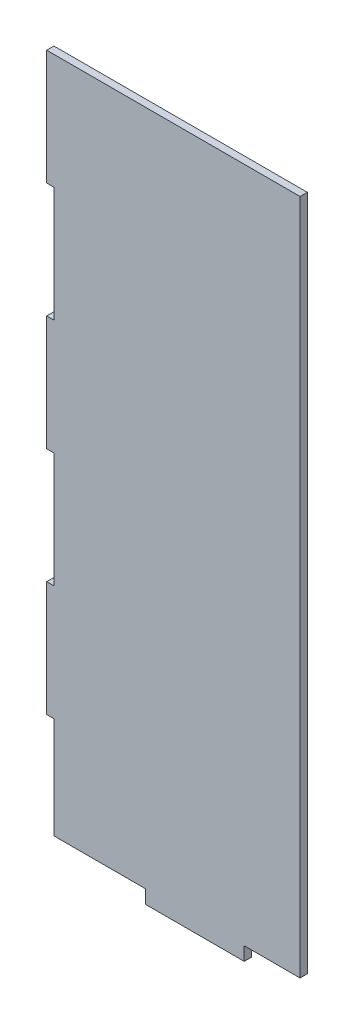
ISO-10303-21;
HEADER;
FILE_DESCRIPTION(('STEP AP214'),'2;1');
FILE_NAME('part.step','',(''),(''),'','','');
FILE_SCHEMA(('AUTOMOTIVE_DESIGN { 1 0 10303 214 1 1 1 1 }'));
ENDSEC;
DATA;
#1=APPLICATION_CONTEXT('core data for automotive mechanical design processes');
#2=APPLICATION_PROTOCOL_DEFINITION('international standard','automotive_design',2000,#1);
#3=PRODUCT_CONTEXT('',#1,'mechanical');
#4=PRODUCT('Part','Part','',(#3));
#5=PRODUCT_RELATED_PRODUCT_CATEGORY('part','',(#4));
#6=PRODUCT_DEFINITION_FORMATION('','',#4);
#7=PRODUCT_DEFINITION_CONTEXT('part definition',#1,'design');
#8=PRODUCT_DEFINITION('design','',#6,#7);
#9=PRODUCT_DEFINITION_SHAPE('','',#8);
#10=(LENGTH_UNIT() NAMED_UNIT(*) SI_UNIT(.MILLI.,.METRE.));
#11=(NAMED_UNIT(*) PLANE_ANGLE_UNIT() SI_UNIT($,.RADIAN.));
#12=(NAMED_UNIT(*) SI_UNIT($,.STERADIAN.) SOLID_ANGLE_UNIT());
#13=UNCERTAINTY_MEASURE_WITH_UNIT(LENGTH_MEASURE(1.E-05),#10,'distance_accuracy_value','');
#14=(GEOMETRIC_REPRESENTATION_CONTEXT(3) GLOBAL_UNCERTAINTY_ASSIGNED_CONTEXT((#13)) GLOBAL_UNIT_ASSIGNED_CONTEXT((#10,
#11,#12)) REPRESENTATION_CONTEXT('',''));
#15=CARTESIAN_POINT('',(0.,0.,0.));
#16=DIRECTION('',(0.,0.,1.));
#17=DIRECTION('',(1.,0.,0.));
#18=AXIS2_PLACEMENT_3D('',#15,#16,#17);
#19=CARTESIAN_POINT('',(0.,139.7,1.4986));
#20=DIRECTION('',(0.,1.,0.));
#21=DIRECTION('',(0.,0.,1.));
#22=AXIS2_PLACEMENT_3D('',#19,#20,#21);
#23=PLANE('',#22);
#24=DIRECTION('',(0.,0.,1.));
#25=VECTOR('',#24,1.);
#26=CARTESIAN_POINT('',(-38.1,139.7,-1.4986));
#27=LINE('',#26,#25);
#28=CARTESIAN_POINT('',(-38.1,139.7,-1.4986));
#29=VERTEX_POINT('',#28);
#30=CARTESIAN_POINT('',(-38.1,139.7,1.4986));
#31=VERTEX_POINT('',#30);
#32=EDGE_CURVE('E308',#29,#31,#27,.T.);
#33=ORIENTED_EDGE('',*,*,#32,.F.);
#34=DIRECTION('',(1.,0.,0.));
#35=VECTOR('',#34,1.);
#36=CARTESIAN_POINT('',(0.,139.7,-1.4986));
#37=LINE('',#36,#35);
#38=CARTESIAN_POINT('',(-142.6972,139.7,-1.4986));
#39=VERTEX_POINT('',#38);
#40=EDGE_CURVE('E195',#39,#29,#37,.T.);
#41=ORIENTED_EDGE('',*,*,#40,.F.);
#42=DIRECTION('',(0.,0.,-1.));
#43=VECTOR('',#42,1.);
#44=CARTESIAN_POINT('',(-142.6972,139.7,1.4986));
#45=LINE('',#44,#43);
#46=CARTESIAN_POINT('',(-142.6972,139.7,1.4986));
#47=VERTEX_POINT('',#46);
#48=EDGE_CURVE('E11',#47,#39,#45,.T.);
#49=ORIENTED_EDGE('',*,*,#48,.F.);
#50=DIRECTION('',(1.,0.,0.));
#51=VECTOR('',#50,1.);
#52=CARTESIAN_POINT('',(0.,139.7,1.4986));
#53=LINE('',#52,#51);
#54=EDGE_CURVE('E316',#47,#31,#53,.T.);
#55=ORIENTED_EDGE('',*,*,#54,.T.);
#56=EDGE_LOOP('',(#33,#41,#49,#55));
#57=FACE_BOUND('',#56,.T.);
#58=ADVANCED_FACE('F36',(#57),#23,.T.);
#59=CARTESIAN_POINT('',(-142.6972,0.,1.4986));
#60=DIRECTION('',(1.,0.,0.));
#61=DIRECTION('',(0.,0.,-1.));
#62=AXIS2_PLACEMENT_3D('',#59,#60,#61);
#63=PLANE('',#62);
#64=DIRECTION('',(0.,-1.,0.));
#65=VECTOR('',#64,1.);
#66=CARTESIAN_POINT('',(-142.6972,0.,-1.4986));
#67=LINE('',#66,#65);
#68=CARTESIAN_POINT('',(-142.6972,92.202,-1.4986));
#69=VERTEX_POINT('',#68);
#70=EDGE_CURVE('E198',#39,#69,#67,.T.);
#71=ORIENTED_EDGE('',*,*,#70,.T.);
#72=DIRECTION('',(0.,0.,-1.));
#73=VECTOR('',#72,1.);
#74=CARTESIAN_POINT('',(-142.6972,92.202,1.4986));
#75=LINE('',#74,#73);
#76=CARTESIAN_POINT('',(-142.6972,92.202,1.4986));
#77=VERTEX_POINT('',#76);
#78=EDGE_CURVE('E43',#77,#69,#75,.T.);
#79=ORIENTED_EDGE('',*,*,#78,.F.);
#80=DIRECTION('',(0.,-1.,0.));
#81=VECTOR('',#80,1.);
#82=CARTESIAN_POINT('',(-142.6972,0.,1.4986));
#83=LINE('',#82,#81);
#84=EDGE_CURVE('E318',#47,#77,#83,.T.);
#85=ORIENTED_EDGE('',*,*,#84,.F.);
#86=ORIENTED_EDGE('',*,*,#48,.T.);
#87=EDGE_LOOP('',(#71,#79,#85,#86));
#88=FACE_BOUND('',#87,.T.);
#89=ADVANCED_FACE('F269',(#88),#63,.F.);
#90=CARTESIAN_POINT('',(0.,92.202,1.4986));
#91=DIRECTION('',(0.,-1.,0.));
#92=DIRECTION('',(0.,0.,-1.));
#93=AXIS2_PLACEMENT_3D('',#90,#91,#92);
#94=PLANE('',#93);
#95=DIRECTION('',(-1.,0.,0.));
#96=VECTOR('',#95,1.);
#97=CARTESIAN_POINT('',(0.,92.202,-1.4986));
#98=LINE('',#97,#96);
#99=CARTESIAN_POINT('',(-139.7,92.202,-1.4986));
#100=VERTEX_POINT('',#99);
#101=EDGE_CURVE('E201',#100,#69,#98,.T.);
#102=ORIENTED_EDGE('',*,*,#101,.F.);
#103=DIRECTION('',(0.,0.,-1.));
#104=VECTOR('',#103,1.);
#105=CARTESIAN_POINT('',(-139.7,92.202,1.4986));
#106=LINE('',#105,#104);
#107=CARTESIAN_POINT('',(-139.7,92.202,1.4986));
#108=VERTEX_POINT('',#107);
#109=EDGE_CURVE('E259',#108,#100,#106,.T.);
#110=ORIENTED_EDGE('',*,*,#109,.F.);
#111=DIRECTION('',(-1.,0.,0.));
#112=VECTOR('',#111,1.);
#113=CARTESIAN_POINT('',(0.,92.202,1.4986));
#114=LINE('',#113,#112);
#115=EDGE_CURVE('E266',#108,#77,#114,.T.);
#116=ORIENTED_EDGE('',*,*,#115,.T.);
#117=ORIENTED_EDGE('',*,*,#78,.T.);
#118=EDGE_LOOP('',(#102,#110,#116,#117));
#119=FACE_BOUND('',#118,.T.);
#120=ADVANCED_FACE('F264',(#119),#94,.T.);
#121=CARTESIAN_POINT('',(-139.7,0.,1.4986));
#122=DIRECTION('',(1.,0.,0.));
#123=DIRECTION('',(0.,0.,-1.));
#124=AXIS2_PLACEMENT_3D('',#121,#122,#123);
#125=PLANE('',#124);
#126=DIRECTION('',(0.,-1.,0.));
#127=VECTOR('',#126,1.);
#128=CARTESIAN_POINT('',(-139.7,0.,-1.4986));
#129=LINE('',#128,#127);
#130=CARTESIAN_POINT('',(-139.7,44.704,-1.4986));
#131=VERTEX_POINT('',#130);
#132=EDGE_CURVE('E204',#100,#131,#129,.T.);
#133=ORIENTED_EDGE('',*,*,#132,.T.);
#134=DIRECTION('',(0.,0.,-1.));
#135=VECTOR('',#134,1.);
#136=CARTESIAN_POINT('',(-139.7,44.704,1.4986));
#137=LINE('',#136,#135);
#138=CARTESIAN_POINT('',(-139.7,44.704,1.4986));
#139=VERTEX_POINT('',#138);
#140=EDGE_CURVE('E256',#139,#131,#137,.T.);
#141=ORIENTED_EDGE('',*,*,#140,.F.);
#142=DIRECTION('',(0.,-1.,0.));
#143=VECTOR('',#142,1.);
#144=CARTESIAN_POINT('',(-139.7,0.,1.4986));
#145=LINE('',#144,#143);
#146=EDGE_CURVE('E286',#108,#139,#145,.T.);
#147=ORIENTED_EDGE('',*,*,#146,.F.);
#148=ORIENTED_EDGE('',*,*,#109,.T.);
#149=EDGE_LOOP('',(#133,#141,#147,#148));
#150=FACE_BOUND('',#149,.T.);
#151=ADVANCED_FACE('F277',(#150),#125,.F.);
#152=CARTESIAN_POINT('',(0.,44.704,1.4986));
#153=DIRECTION('',(0.,-1.,0.));
#154=DIRECTION('',(0.,0.,-1.));
#155=AXIS2_PLACEMENT_3D('',#152,#153,#154);
#156=PLANE('',#155);
#157=DIRECTION('',(-1.,0.,0.));
#158=VECTOR('',#157,1.);
#159=CARTESIAN_POINT('',(0.,44.704,-1.4986));
#160=LINE('',#159,#158);
#161=CARTESIAN_POINT('',(-142.6972,44.704,-1.4986));
#162=VERTEX_POINT('',#161);
#163=EDGE_CURVE('E206',#131,#162,#160,.T.);
#164=ORIENTED_EDGE('',*,*,#163,.T.);
#165=DIRECTION('',(0.,0.,-1.));
#166=VECTOR('',#165,1.);
#167=CARTESIAN_POINT('',(-142.6972,44.704,1.4986));
#168=LINE('',#167,#166);
#169=CARTESIAN_POINT('',(-142.6972,44.704,1.4986));
#170=VERTEX_POINT('',#169);
#171=EDGE_CURVE('E253',#170,#162,#168,.T.);
#172=ORIENTED_EDGE('',*,*,#171,.F.);
#173=DIRECTION('',(-1.,0.,0.));
#174=VECTOR('',#173,1.);
#175=CARTESIAN_POINT('',(0.,44.704,1.4986));
#176=LINE('',#175,#174);
#177=EDGE_CURVE('E283',#139,#170,#176,.T.);
#178=ORIENTED_EDGE('',*,*,#177,.F.);
#179=ORIENTED_EDGE('',*,*,#140,.T.);
#180=EDGE_LOOP('',(#164,#172,#178,#179));
#181=FACE_BOUND('',#180,.T.);
#182=ADVANCED_FACE('F281',(#181),#156,.F.);
#183=CARTESIAN_POINT('',(-142.697199999999,0.,1.4986));
#184=DIRECTION('',(1.,0.,0.));
#185=DIRECTION('',(0.,0.,-1.));
#186=AXIS2_PLACEMENT_3D('',#183,#184,#185);
#187=PLANE('',#186);
#188=DIRECTION('',(0.,-1.,0.));
#189=VECTOR('',#188,1.);
#190=CARTESIAN_POINT('',(-142.697199999999,0.,-1.4986));
#191=LINE('',#190,#189);
#192=CARTESIAN_POINT('',(-142.697199999999,-2.79400000000005,-1.4986));
#193=VERTEX_POINT('',#192);
#194=EDGE_CURVE('E210',#162,#193,#191,.T.);
#195=ORIENTED_EDGE('',*,*,#194,.T.);
#196=DIRECTION('',(0.,0.,-1.));
#197=VECTOR('',#196,1.);
#198=CARTESIAN_POINT('',(-142.697199999999,-2.79400000000005,1.4986));
#199=LINE('',#198,#197);
#200=CARTESIAN_POINT('',(-142.697199999999,-2.79400000000005,1.4986));
#201=VERTEX_POINT('',#200);
#202=EDGE_CURVE('E251',#201,#193,#199,.T.);
#203=ORIENTED_EDGE('',*,*,#202,.F.);
#204=DIRECTION('',(0.,-1.,0.));
#205=VECTOR('',#204,1.);
#206=CARTESIAN_POINT('',(-142.697199999999,0.,1.4986));
#207=LINE('',#206,#205);
#208=EDGE_CURVE('E285',#170,#201,#207,.T.);
#209=ORIENTED_EDGE('',*,*,#208,.F.);
#210=ORIENTED_EDGE('',*,*,#171,.T.);
#211=EDGE_LOOP('',(#195,#203,#209,#210));
#212=FACE_BOUND('',#211,.T.);
#213=ADVANCED_FACE('F354',(#212),#187,.F.);
#214=CARTESIAN_POINT('',(0.,-2.79400000000005,1.4986));
#215=DIRECTION('',(0.,-1.,0.));
#216=DIRECTION('',(0.,0.,-1.));
#217=AXIS2_PLACEMENT_3D('',#214,#215,#216);
#218=PLANE('',#217);
#219=DIRECTION('',(-1.,0.,0.));
#220=VECTOR('',#219,1.);
#221=CARTESIAN_POINT('',(0.,-2.79400000000005,-1.4986));
#222=LINE('',#221,#220);
#223=CARTESIAN_POINT('',(-139.7,-2.79400000000005,-1.4986));
#224=VERTEX_POINT('',#223);
#225=EDGE_CURVE('E213',#224,#193,#222,.T.);
#226=ORIENTED_EDGE('',*,*,#225,.F.);
#227=DIRECTION('',(0.,0.,-1.));
#228=VECTOR('',#227,1.);
#229=CARTESIAN_POINT('',(-139.7,-2.79400000000005,1.4986));
#230=LINE('',#229,#228);
#231=CARTESIAN_POINT('',(-139.7,-2.79400000000005,1.4986));
#232=VERTEX_POINT('',#231);
#233=EDGE_CURVE('E249',#232,#224,#230,.T.);
#234=ORIENTED_EDGE('',*,*,#233,.F.);
#235=DIRECTION('',(-1.,0.,0.));
#236=VECTOR('',#235,1.);
#237=CARTESIAN_POINT('',(0.,-2.79400000000005,1.4986));
#238=LINE('',#237,#236);
#239=EDGE_CURVE('E288',#232,#201,#238,.T.);
#240=ORIENTED_EDGE('',*,*,#239,.T.);
#241=ORIENTED_EDGE('',*,*,#202,.T.);
#242=EDGE_LOOP('',(#226,#234,#240,#241));
#243=FACE_BOUND('',#242,.T.);
#244=ADVANCED_FACE('F352',(#243),#218,.T.);
#245=CARTESIAN_POINT('',(-139.7,-50.2920000000001,-1.4986));
#246=VERTEX_POINT('',#245);
#247=EDGE_CURVE('E208',#224,#246,#129,.T.);
#248=ORIENTED_EDGE('',*,*,#247,.T.);
#249=DIRECTION('',(0.,0.,-1.));
#250=VECTOR('',#249,1.);
#251=CARTESIAN_POINT('',(-139.7,-50.2920000000001,1.4986));
#252=LINE('',#251,#250);
#253=CARTESIAN_POINT('',(-139.7,-50.2920000000001,1.4986));
#254=VERTEX_POINT('',#253);
#255=EDGE_CURVE('E246',#254,#246,#252,.T.);
#256=ORIENTED_EDGE('',*,*,#255,.F.);
#257=EDGE_CURVE('E292',#232,#254,#145,.T.);
#258=ORIENTED_EDGE('',*,*,#257,.F.);
#259=ORIENTED_EDGE('',*,*,#233,.T.);
#260=EDGE_LOOP('',(#248,#256,#258,#259));
#261=FACE_BOUND('',#260,.T.);
#262=ADVANCED_FACE('F336',(#261),#125,.F.);
#263=CARTESIAN_POINT('',(0.,-50.2920000000001,1.4986));
#264=DIRECTION('',(0.,-1.,0.));
#265=DIRECTION('',(0.,0.,-1.));
#266=AXIS2_PLACEMENT_3D('',#263,#264,#265);
#267=PLANE('',#266);
#268=DIRECTION('',(-1.,0.,0.));
#269=VECTOR('',#268,1.);
#270=CARTESIAN_POINT('',(0.,-50.2920000000001,-1.4986));
#271=LINE('',#270,#269);
#272=CARTESIAN_POINT('',(-142.697199999999,-50.2920000000001,-1.4986));
#273=VERTEX_POINT('',#272);
#274=EDGE_CURVE('E216',#246,#273,#271,.T.);
#275=ORIENTED_EDGE('',*,*,#274,.T.);
#276=DIRECTION('',(0.,0.,-1.));
#277=VECTOR('',#276,1.);
#278=CARTESIAN_POINT('',(-142.697199999999,-50.2920000000001,1.4986));
#279=LINE('',#278,#277);
#280=CARTESIAN_POINT('',(-142.697199999999,-50.2920000000001,1.4986));
#281=VERTEX_POINT('',#280);
#282=EDGE_CURVE('E243',#281,#273,#279,.T.);
#283=ORIENTED_EDGE('',*,*,#282,.F.);
#284=DIRECTION('',(-1.,0.,0.));
#285=VECTOR('',#284,1.);
#286=CARTESIAN_POINT('',(0.,-50.2920000000001,1.4986));
#287=LINE('',#286,#285);
#288=EDGE_CURVE('E297',#254,#281,#287,.T.);
#289=ORIENTED_EDGE('',*,*,#288,.F.);
#290=ORIENTED_EDGE('',*,*,#255,.T.);
#291=EDGE_LOOP('',(#275,#283,#289,#290));
#292=FACE_BOUND('',#291,.T.);
#293=ADVANCED_FACE('F342',(#292),#267,.F.);
#294=CARTESIAN_POINT('',(-142.697199999998,0.,1.4986));
#295=DIRECTION('',(1.,0.,0.));
#296=DIRECTION('',(0.,0.,-1.));
#297=AXIS2_PLACEMENT_3D('',#294,#295,#296);
#298=PLANE('',#297);
#299=DIRECTION('',(0.,-1.,0.));
#300=VECTOR('',#299,1.);
#301=CARTESIAN_POINT('',(-142.697199999998,0.,-1.4986));
#302=LINE('',#301,#300);
#303=CARTESIAN_POINT('',(-142.697199999998,-97.7900000000001,-1.4986));
#304=VERTEX_POINT('',#303);
#305=EDGE_CURVE('E218',#273,#304,#302,.T.);
#306=ORIENTED_EDGE('',*,*,#305,.T.);
#307=DIRECTION('',(0.,0.,-1.));
#308=VECTOR('',#307,1.);
#309=CARTESIAN_POINT('',(-142.697199999998,-97.7900000000001,1.4986));
#310=LINE('',#309,#308);
#311=CARTESIAN_POINT('',(-142.697199999998,-97.7900000000001,1.4986));
#312=VERTEX_POINT('',#311);
#313=EDGE_CURVE('E241',#312,#304,#310,.T.);
#314=ORIENTED_EDGE('',*,*,#313,.F.);
#315=DIRECTION('',(0.,-1.,0.));
#316=VECTOR('',#315,1.);
#317=CARTESIAN_POINT('',(-142.697199999998,0.,1.4986));
#318=LINE('',#317,#316);
#319=EDGE_CURVE('E299',#281,#312,#318,.T.);
#320=ORIENTED_EDGE('',*,*,#319,.F.);
#321=ORIENTED_EDGE('',*,*,#282,.T.);
#322=EDGE_LOOP('',(#306,#314,#320,#321));
#323=FACE_BOUND('',#322,.T.);
#324=ADVANCED_FACE('F347',(#323),#298,.F.);
#325=CARTESIAN_POINT('',(0.,-97.7900000000001,1.4986));
#326=DIRECTION('',(0.,-1.,0.));
#327=DIRECTION('',(0.,0.,-1.));
#328=AXIS2_PLACEMENT_3D('',#325,#326,#327);
#329=PLANE('',#328);
#330=DIRECTION('',(-1.,0.,0.));
#331=VECTOR('',#330,1.);
#332=CARTESIAN_POINT('',(0.,-97.7900000000001,-1.4986));
#333=LINE('',#332,#331);
#334=CARTESIAN_POINT('',(-139.7,-97.7900000000001,-1.4986));
#335=VERTEX_POINT('',#334);
#336=EDGE_CURVE('E221',#335,#304,#333,.T.);
#337=ORIENTED_EDGE('',*,*,#336,.F.);
#338=DIRECTION('',(0.,0.,-1.));
#339=VECTOR('',#338,1.);
#340=CARTESIAN_POINT('',(-139.7,-97.7900000000001,1.4986));
#341=LINE('',#340,#339);
#342=CARTESIAN_POINT('',(-139.7,-97.7900000000001,1.4986));
#343=VERTEX_POINT('',#342);
#344=EDGE_CURVE('E239',#343,#335,#341,.T.);
#345=ORIENTED_EDGE('',*,*,#344,.F.);
#346=DIRECTION('',(-1.,0.,0.));
#347=VECTOR('',#346,1.);
#348=CARTESIAN_POINT('',(0.,-97.7900000000001,1.4986));
#349=LINE('',#348,#347);
#350=EDGE_CURVE('E301',#343,#312,#349,.T.);
#351=ORIENTED_EDGE('',*,*,#350,.T.);
#352=ORIENTED_EDGE('',*,*,#313,.T.);
#353=EDGE_LOOP('',(#337,#345,#351,#352));
#354=FACE_BOUND('',#353,.T.);
#355=ADVANCED_FACE('F381',(#354),#329,.T.);
#356=CARTESIAN_POINT('',(-139.7,-139.7,-1.4986));
#357=VERTEX_POINT('',#356);
#358=EDGE_CURVE('E207',#335,#357,#129,.T.);
#359=ORIENTED_EDGE('',*,*,#358,.T.);
#360=DIRECTION('',(0.,0.,-1.));
#361=VECTOR('',#360,1.);
#362=CARTESIAN_POINT('',(-139.7,-139.7,1.4986));
#363=LINE('',#362,#361);
#364=CARTESIAN_POINT('',(-139.7,-139.7,1.4986));
#365=VERTEX_POINT('',#364);
#366=EDGE_CURVE('E236',#365,#357,#363,.T.);
#367=ORIENTED_EDGE('',*,*,#366,.F.);
#368=EDGE_CURVE('E291',#343,#365,#145,.T.);
#369=ORIENTED_EDGE('',*,*,#368,.F.);
#370=ORIENTED_EDGE('',*,*,#344,.T.);
#371=EDGE_LOOP('',(#359,#367,#369,#370));
#372=FACE_BOUND('',#371,.T.);
#373=ADVANCED_FACE('F331',(#372),#125,.F.);
#374=CARTESIAN_POINT('',(0.,-139.7,1.4986));
#375=DIRECTION('',(0.,1.,0.));
#376=DIRECTION('',(0.,0.,1.));
#377=AXIS2_PLACEMENT_3D('',#374,#375,#376);
#378=PLANE('',#377);
#379=DIRECTION('',(1.,0.,0.));
#380=VECTOR('',#379,1.);
#381=CARTESIAN_POINT('',(0.,-139.7,-1.4986));
#382=LINE('',#381,#380);
#383=CARTESIAN_POINT('',(-101.926571428571,-139.7,-1.4986));
#384=VERTEX_POINT('',#383);
#385=EDGE_CURVE('E224',#357,#384,#382,.T.);
#386=ORIENTED_EDGE('',*,*,#385,.T.);
#387=DIRECTION('',(0.,0.,-1.));
#388=VECTOR('',#387,1.);
#389=CARTESIAN_POINT('',(-101.926571428571,-139.7,1.4986));
#390=LINE('',#389,#388);
#391=CARTESIAN_POINT('',(-101.926571428571,-139.7,1.4986));
#392=VERTEX_POINT('',#391);
#393=EDGE_CURVE('E185',#392,#384,#390,.T.);
#394=ORIENTED_EDGE('',*,*,#393,.F.);
#395=DIRECTION('',(1.,0.,0.));
#396=VECTOR('',#395,1.);
#397=CARTESIAN_POINT('',(0.,-139.7,1.4986));
#398=LINE('',#397,#396);
#399=EDGE_CURVE('E172',#365,#392,#398,.T.);
#400=ORIENTED_EDGE('',*,*,#399,.F.);
#401=ORIENTED_EDGE('',*,*,#366,.T.);
#402=EDGE_LOOP('',(#386,#394,#400,#401));
#403=FACE_BOUND('',#402,.T.);
#404=ADVANCED_FACE('F327',(#403),#378,.F.);
#405=CARTESIAN_POINT('',(-101.926571428571,0.,1.4986));
#406=DIRECTION('',(1.,0.,0.));
#407=DIRECTION('',(0.,0.,-1.));
#408=AXIS2_PLACEMENT_3D('',#405,#406,#407);
#409=PLANE('',#408);
#410=DIRECTION('',(0.,-1.,0.));
#411=VECTOR('',#410,1.);
#412=CARTESIAN_POINT('',(-101.926571428571,0.,-1.4986));
#413=LINE('',#412,#411);
#414=CARTESIAN_POINT('',(-101.926571428571,-145.288,-1.4986));
#415=VERTEX_POINT('',#414);
#416=EDGE_CURVE('E181',#384,#415,#413,.T.);
#417=ORIENTED_EDGE('',*,*,#416,.T.);
#418=DIRECTION('',(0.,0.,-1.));
#419=VECTOR('',#418,1.);
#420=CARTESIAN_POINT('',(-101.926571428571,-145.288,1.4986));
#421=LINE('',#420,#419);
#422=CARTESIAN_POINT('',(-101.926571428571,-145.288,1.4986));
#423=VERTEX_POINT('',#422);
#424=EDGE_CURVE('E178',#423,#415,#421,.T.);
#425=ORIENTED_EDGE('',*,*,#424,.F.);
#426=DIRECTION('',(0.,-1.,0.));
#427=VECTOR('',#426,1.);
#428=CARTESIAN_POINT('',(-101.926571428571,0.,1.4986));
#429=LINE('',#428,#427);
#430=EDGE_CURVE('E164',#392,#423,#429,.T.);
#431=ORIENTED_EDGE('',*,*,#430,.F.);
#432=ORIENTED_EDGE('',*,*,#393,.T.);
#433=EDGE_LOOP('',(#417,#425,#431,#432));
#434=FACE_BOUND('',#433,.T.);
#435=ADVANCED_FACE('F179',(#434),#409,.F.);
#436=CARTESIAN_POINT('',(0.,-145.288,1.4986));
#437=DIRECTION('',(0.,-1.,0.));
#438=DIRECTION('',(0.,0.,-1.));
#439=AXIS2_PLACEMENT_3D('',#436,#437,#438);
#440=PLANE('',#439);
#441=DIRECTION('',(-1.,0.,0.));
#442=VECTOR('',#441,1.);
#443=CARTESIAN_POINT('',(0.,-145.288,-1.4986));
#444=LINE('',#443,#442);
#445=CARTESIAN_POINT('',(-61.1559428571429,-145.288,-1.4986));
#446=VERTEX_POINT('',#445);
#447=EDGE_CURVE('E228',#446,#415,#444,.T.);
#448=ORIENTED_EDGE('',*,*,#447,.F.);
#449=DIRECTION('',(0.,0.,-1.));
#450=VECTOR('',#449,1.);
#451=CARTESIAN_POINT('',(-61.1559428571429,-145.288,1.4986));
#452=LINE('',#451,#450);
#453=CARTESIAN_POINT('',(-61.1559428571429,-145.288,1.4986));
#454=VERTEX_POINT('',#453);
#455=EDGE_CURVE('E186',#454,#446,#452,.T.);
#456=ORIENTED_EDGE('',*,*,#455,.F.);
#457=DIRECTION('',(-1.,0.,0.));
#458=VECTOR('',#457,1.);
#459=CARTESIAN_POINT('',(0.,-145.288,1.4986));
#460=LINE('',#459,#458);
#461=EDGE_CURVE('E170',#454,#423,#460,.T.);
#462=ORIENTED_EDGE('',*,*,#461,.T.);
#463=ORIENTED_EDGE('',*,*,#424,.T.);
#464=EDGE_LOOP('',(#448,#456,#462,#463));
#465=FACE_BOUND('',#464,.T.);
#466=ADVANCED_FACE('F188',(#465),#440,.T.);
#467=CARTESIAN_POINT('',(-61.1559428571429,0.,1.4986));
#468=DIRECTION('',(1.,0.,0.));
#469=DIRECTION('',(0.,0.,-1.));
#470=AXIS2_PLACEMENT_3D('',#467,#468,#469);
#471=PLANE('',#470);
#472=DIRECTION('',(0.,-1.,0.));
#473=VECTOR('',#472,1.);
#474=CARTESIAN_POINT('',(-61.1559428571429,0.,-1.4986));
#475=LINE('',#474,#473);
#476=CARTESIAN_POINT('',(-61.1559428571429,-139.7,-1.4986));
#477=VERTEX_POINT('',#476);
#478=EDGE_CURVE('E230',#477,#446,#475,.T.);
#479=ORIENTED_EDGE('',*,*,#478,.F.);
#480=DIRECTION('',(0.,0.,-1.));
#481=VECTOR('',#480,1.);
#482=CARTESIAN_POINT('',(-61.1559428571429,-139.7,1.4986));
#483=LINE('',#482,#481);
#484=CARTESIAN_POINT('',(-61.1559428571429,-139.7,1.4986));
#485=VERTEX_POINT('',#484);
#486=EDGE_CURVE('E59',#485,#477,#483,.T.);
#487=ORIENTED_EDGE('',*,*,#486,.F.);
#488=DIRECTION('',(0.,-1.,0.));
#489=VECTOR('',#488,1.);
#490=CARTESIAN_POINT('',(-61.1559428571429,0.,1.4986));
#491=LINE('',#490,#489);
#492=EDGE_CURVE('E189',#485,#454,#491,.T.);
#493=ORIENTED_EDGE('',*,*,#492,.T.);
#494=ORIENTED_EDGE('',*,*,#455,.T.);
#495=EDGE_LOOP('',(#479,#487,#493,#494));
#496=FACE_BOUND('',#495,.T.);
#497=ADVANCED_FACE('F322',(#496),#471,.T.);
#498=CARTESIAN_POINT('',(-38.1,-139.7,-1.4986));
#499=VERTEX_POINT('',#498);
#500=EDGE_CURVE('E226',#477,#499,#382,.T.);
#501=ORIENTED_EDGE('',*,*,#500,.T.);
#502=DIRECTION('',(0.,0.,1.));
#503=VECTOR('',#502,1.);
#504=CARTESIAN_POINT('',(-38.1,-139.7,-1.4986));
#505=LINE('',#504,#503);
#506=CARTESIAN_POINT('',(-38.1,-139.7,1.4986));
#507=VERTEX_POINT('',#506);
#508=EDGE_CURVE('E50',#499,#507,#505,.T.);
#509=ORIENTED_EDGE('',*,*,#508,.T.);
#510=EDGE_CURVE('E191',#485,#507,#398,.T.);
#511=ORIENTED_EDGE('',*,*,#510,.F.);
#512=ORIENTED_EDGE('',*,*,#486,.T.);
#513=EDGE_LOOP('',(#501,#509,#511,#512));
#514=FACE_BOUND('',#513,.T.);
#515=ADVANCED_FACE('F307',(#514),#378,.F.);
#516=CARTESIAN_POINT('',(0.,0.,1.4986));
#517=DIRECTION('',(0.,0.,1.));
#518=DIRECTION('',(1.,0.,0.));
#519=AXIS2_PLACEMENT_3D('',#516,#517,#518);
#520=PLANE('',#519);
#521=DIRECTION('',(0.,-1.,0.));
#522=VECTOR('',#521,1.);
#523=CARTESIAN_POINT('',(-38.1,0.,1.4986));
#524=LINE('',#523,#522);
#525=EDGE_CURVE('E306',#31,#507,#524,.T.);
#526=ORIENTED_EDGE('',*,*,#525,.F.);
#527=ORIENTED_EDGE('',*,*,#54,.F.);
#528=ORIENTED_EDGE('',*,*,#84,.T.);
#529=ORIENTED_EDGE('',*,*,#115,.F.);
#530=ORIENTED_EDGE('',*,*,#146,.T.);
#531=ORIENTED_EDGE('',*,*,#177,.T.);
#532=ORIENTED_EDGE('',*,*,#208,.T.);
#533=ORIENTED_EDGE('',*,*,#239,.F.);
#534=ORIENTED_EDGE('',*,*,#257,.T.);
#535=ORIENTED_EDGE('',*,*,#288,.T.);
#536=ORIENTED_EDGE('',*,*,#319,.T.);
#537=ORIENTED_EDGE('',*,*,#350,.F.);
#538=ORIENTED_EDGE('',*,*,#368,.T.);
#539=ORIENTED_EDGE('',*,*,#399,.T.);
#540=ORIENTED_EDGE('',*,*,#430,.T.);
#541=ORIENTED_EDGE('',*,*,#461,.F.);
#542=ORIENTED_EDGE('',*,*,#492,.F.);
#543=ORIENTED_EDGE('',*,*,#510,.T.);
#544=EDGE_LOOP('',(#526,#527,#528,#529,#530,#531,#532,#533,#534,#535,#536,#537,#538,#539,#540,
#541,#542,#543));
#545=FACE_BOUND('',#544,.T.);
#546=ADVANCED_FACE('F167',(#545),#520,.T.);
#547=CARTESIAN_POINT('',(0.,0.,-1.4986));
#548=DIRECTION('',(0.,0.,1.));
#549=DIRECTION('',(1.,0.,0.));
#550=AXIS2_PLACEMENT_3D('',#547,#548,#549);
#551=PLANE('',#550);
#552=ORIENTED_EDGE('',*,*,#40,.T.);
#553=DIRECTION('',(0.,-1.,0.));
#554=VECTOR('',#553,1.);
#555=CARTESIAN_POINT('',(-38.1,0.,-1.4986));
#556=LINE('',#555,#554);
#557=EDGE_CURVE('E311',#29,#499,#556,.T.);
#558=ORIENTED_EDGE('',*,*,#557,.T.);
#559=ORIENTED_EDGE('',*,*,#500,.F.);
#560=ORIENTED_EDGE('',*,*,#478,.T.);
#561=ORIENTED_EDGE('',*,*,#447,.T.);
#562=ORIENTED_EDGE('',*,*,#416,.F.);
#563=ORIENTED_EDGE('',*,*,#385,.F.);
#564=ORIENTED_EDGE('',*,*,#358,.F.);
#565=ORIENTED_EDGE('',*,*,#336,.T.);
#566=ORIENTED_EDGE('',*,*,#305,.F.);
#567=ORIENTED_EDGE('',*,*,#274,.F.);
#568=ORIENTED_EDGE('',*,*,#247,.F.);
#569=ORIENTED_EDGE('',*,*,#225,.T.);
#570=ORIENTED_EDGE('',*,*,#194,.F.);
#571=ORIENTED_EDGE('',*,*,#163,.F.);
#572=ORIENTED_EDGE('',*,*,#132,.F.);
#573=ORIENTED_EDGE('',*,*,#101,.T.);
#574=ORIENTED_EDGE('',*,*,#70,.F.);
#575=EDGE_LOOP('',(#552,#558,#559,#560,#561,#562,#563,#564,#565,#566,#567,#568,#569,#570,#571,
#572,#573,#574));
#576=FACE_BOUND('',#575,.T.);
#577=ADVANCED_FACE('F272',(#576),#551,.F.);
#578=CARTESIAN_POINT('',(-38.1,0.,-1.4986));
#579=DIRECTION('',(-1.,0.,0.));
#580=DIRECTION('',(0.,-1.,0.));
#581=AXIS2_PLACEMENT_3D('',#578,#579,#580);
#582=PLANE('',#581);
#583=ORIENTED_EDGE('',*,*,#525,.T.);
#584=ORIENTED_EDGE('',*,*,#508,.F.);
#585=ORIENTED_EDGE('',*,*,#557,.F.);
#586=ORIENTED_EDGE('',*,*,#32,.T.);
#587=EDGE_LOOP('',(#583,#584,#585,#586));
#588=FACE_BOUND('',#587,.T.);
#589=ADVANCED_FACE('F321',(#588),#582,.F.);
#590=CLOSED_SHELL('',(#58,#89,#120,#151,#182,#213,#244,#262,#293,#324,#355,#373,#404,#435,#466,
#497,#515,#546,#577,#589));
#591=MANIFOLD_SOLID_BREP('B2',#590);
#592=ADVANCED_BREP_SHAPE_REPRESENTATION('',(#18,#591),#14);
#593=SHAPE_DEFINITION_REPRESENTATION(#9,#592);
ENDSEC;
END-ISO-10303-21;
